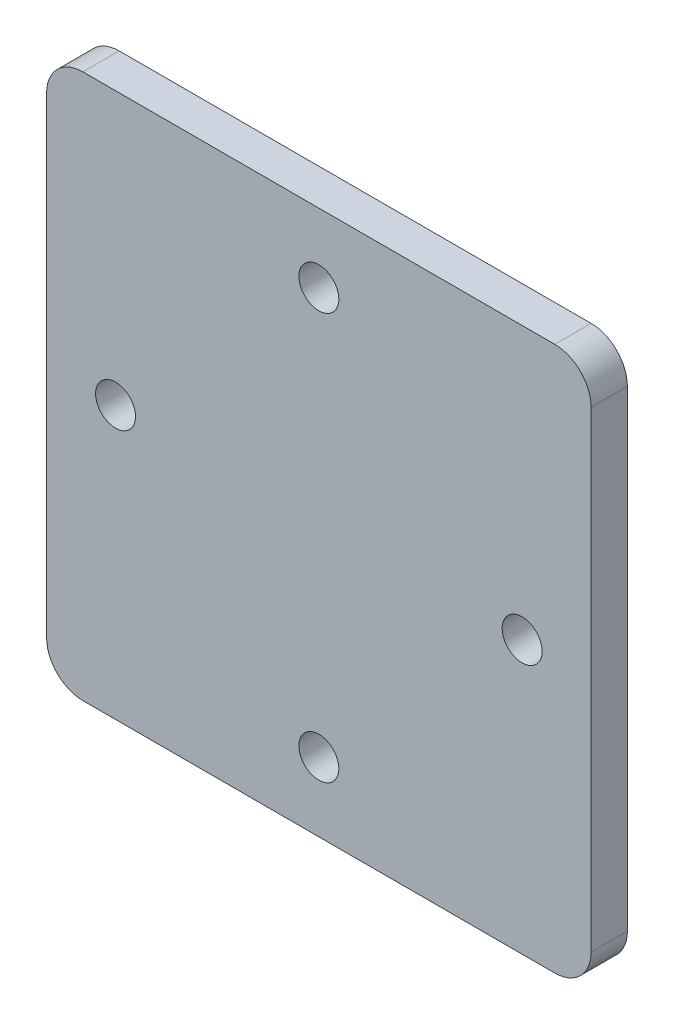
ISO-10303-21;
HEADER;
FILE_DESCRIPTION(('STEP AP214'),'2;1');
FILE_NAME('part.step','',(''),(''),'','','');
FILE_SCHEMA(('AUTOMOTIVE_DESIGN { 1 0 10303 214 1 1 1 1 }'));
ENDSEC;
DATA;
#1=APPLICATION_CONTEXT('core data for automotive mechanical design processes');
#2=APPLICATION_PROTOCOL_DEFINITION('international standard','automotive_design',2000,#1);
#3=PRODUCT_CONTEXT('',#1,'mechanical');
#4=PRODUCT('Part','Part','',(#3));
#5=PRODUCT_RELATED_PRODUCT_CATEGORY('part','',(#4));
#6=PRODUCT_DEFINITION_FORMATION('','',#4);
#7=PRODUCT_DEFINITION_CONTEXT('part definition',#1,'design');
#8=PRODUCT_DEFINITION('design','',#6,#7);
#9=PRODUCT_DEFINITION_SHAPE('','',#8);
#10=(LENGTH_UNIT() NAMED_UNIT(*) SI_UNIT(.MILLI.,.METRE.));
#11=(NAMED_UNIT(*) PLANE_ANGLE_UNIT() SI_UNIT($,.RADIAN.));
#12=(NAMED_UNIT(*) SI_UNIT($,.STERADIAN.) SOLID_ANGLE_UNIT());
#13=UNCERTAINTY_MEASURE_WITH_UNIT(LENGTH_MEASURE(1.E-05),#10,'distance_accuracy_value','');
#14=(GEOMETRIC_REPRESENTATION_CONTEXT(3) GLOBAL_UNCERTAINTY_ASSIGNED_CONTEXT((#13)) GLOBAL_UNIT_ASSIGNED_CONTEXT((#10,
#11,#12)) REPRESENTATION_CONTEXT('',''));
#15=CARTESIAN_POINT('',(0.,0.,0.));
#16=DIRECTION('',(0.,0.,1.));
#17=DIRECTION('',(1.,0.,0.));
#18=AXIS2_PLACEMENT_3D('',#15,#16,#17);
#19=CARTESIAN_POINT('',(-65.,65.,10.));
#20=DIRECTION('',(0.,0.,-1.));
#21=DIRECTION('',(-1.,0.,0.));
#22=AXIS2_PLACEMENT_3D('',#19,#20,#21);
#23=CYLINDRICAL_SURFACE('',#22,10.);
#24=CARTESIAN_POINT('',(-65.,65.,0.));
#25=DIRECTION('',(0.,0.,1.));
#26=DIRECTION('',(1.,0.,0.));
#27=AXIS2_PLACEMENT_3D('',#24,#25,#26);
#28=CIRCLE('',#27,10.);
#29=CARTESIAN_POINT('',(-65.,75.,0.));
#30=VERTEX_POINT('',#29);
#31=CARTESIAN_POINT('',(-75.,65.,0.));
#32=VERTEX_POINT('',#31);
#33=EDGE_CURVE('E131',#30,#32,#28,.T.);
#34=ORIENTED_EDGE('',*,*,#33,.T.);
#35=DIRECTION('',(0.,0.,-1.));
#36=VECTOR('',#35,1.);
#37=CARTESIAN_POINT('',(-75.,65.,10.));
#38=LINE('',#37,#36);
#39=CARTESIAN_POINT('',(-75.,65.,10.));
#40=VERTEX_POINT('',#39);
#41=EDGE_CURVE('E11',#40,#32,#38,.T.);
#42=ORIENTED_EDGE('',*,*,#41,.F.);
#43=CARTESIAN_POINT('',(-65.,65.,10.));
#44=DIRECTION('',(0.,0.,1.));
#45=DIRECTION('',(1.,0.,0.));
#46=AXIS2_PLACEMENT_3D('',#43,#44,#45);
#47=CIRCLE('',#46,10.);
#48=CARTESIAN_POINT('',(-65.,75.,10.));
#49=VERTEX_POINT('',#48);
#50=EDGE_CURVE('E146',#49,#40,#47,.T.);
#51=ORIENTED_EDGE('',*,*,#50,.F.);
#52=DIRECTION('',(0.,0.,-1.));
#53=VECTOR('',#52,1.);
#54=CARTESIAN_POINT('',(-65.,75.,10.));
#55=LINE('',#54,#53);
#56=EDGE_CURVE('E127',#49,#30,#55,.T.);
#57=ORIENTED_EDGE('',*,*,#56,.T.);
#58=EDGE_LOOP('',(#34,#42,#51,#57));
#59=FACE_BOUND('',#58,.T.);
#60=ADVANCED_FACE('F35',(#59),#23,.T.);
#61=CARTESIAN_POINT('',(-75.,-65.,10.));
#62=DIRECTION('',(1.,0.,0.));
#63=DIRECTION('',(0.,1.,0.));
#64=AXIS2_PLACEMENT_3D('',#61,#62,#63);
#65=PLANE('',#64);
#66=DIRECTION('',(0.,-1.,0.));
#67=VECTOR('',#66,1.);
#68=CARTESIAN_POINT('',(-75.,-65.,0.));
#69=LINE('',#68,#67);
#70=CARTESIAN_POINT('',(-75.,-65.,0.));
#71=VERTEX_POINT('',#70);
#72=EDGE_CURVE('E134',#32,#71,#69,.T.);
#73=ORIENTED_EDGE('',*,*,#72,.T.);
#74=DIRECTION('',(0.,0.,-1.));
#75=VECTOR('',#74,1.);
#76=CARTESIAN_POINT('',(-75.,-65.,10.));
#77=LINE('',#76,#75);
#78=CARTESIAN_POINT('',(-75.,-65.,10.));
#79=VERTEX_POINT('',#78);
#80=EDGE_CURVE('E43',#79,#71,#77,.T.);
#81=ORIENTED_EDGE('',*,*,#80,.F.);
#82=DIRECTION('',(0.,-1.,0.));
#83=VECTOR('',#82,1.);
#84=CARTESIAN_POINT('',(-75.,-65.,10.));
#85=LINE('',#84,#83);
#86=EDGE_CURVE('E94',#40,#79,#85,.T.);
#87=ORIENTED_EDGE('',*,*,#86,.F.);
#88=ORIENTED_EDGE('',*,*,#41,.T.);
#89=EDGE_LOOP('',(#73,#81,#87,#88));
#90=FACE_BOUND('',#89,.T.);
#91=ADVANCED_FACE('F228',(#90),#65,.F.);
#92=CARTESIAN_POINT('',(-65.,-65.,10.));
#93=DIRECTION('',(0.,0.,-1.));
#94=DIRECTION('',(-1.,0.,0.));
#95=AXIS2_PLACEMENT_3D('',#92,#93,#94);
#96=CYLINDRICAL_SURFACE('',#95,10.);
#97=CARTESIAN_POINT('',(-65.,-65.,0.));
#98=DIRECTION('',(0.,0.,1.));
#99=DIRECTION('',(-1.,0.,0.));
#100=AXIS2_PLACEMENT_3D('',#97,#98,#99);
#101=CIRCLE('',#100,10.);
#102=CARTESIAN_POINT('',(-65.,-75.,0.));
#103=VERTEX_POINT('',#102);
#104=EDGE_CURVE('E137',#71,#103,#101,.T.);
#105=ORIENTED_EDGE('',*,*,#104,.T.);
#106=DIRECTION('',(0.,0.,-1.));
#107=VECTOR('',#106,1.);
#108=CARTESIAN_POINT('',(-65.,-75.,10.));
#109=LINE('',#108,#107);
#110=CARTESIAN_POINT('',(-65.,-75.,10.));
#111=VERTEX_POINT('',#110);
#112=EDGE_CURVE('E153',#111,#103,#109,.T.);
#113=ORIENTED_EDGE('',*,*,#112,.F.);
#114=CARTESIAN_POINT('',(-65.,-65.,10.));
#115=DIRECTION('',(0.,0.,1.));
#116=DIRECTION('',(-1.,0.,0.));
#117=AXIS2_PLACEMENT_3D('',#114,#115,#116);
#118=CIRCLE('',#117,10.);
#119=EDGE_CURVE('E161',#79,#111,#118,.T.);
#120=ORIENTED_EDGE('',*,*,#119,.F.);
#121=ORIENTED_EDGE('',*,*,#80,.T.);
#122=EDGE_LOOP('',(#105,#113,#120,#121));
#123=FACE_BOUND('',#122,.T.);
#124=ADVANCED_FACE('F159',(#123),#96,.T.);
#125=CARTESIAN_POINT('',(65.,-75.,10.));
#126=DIRECTION('',(0.,1.,0.));
#127=DIRECTION('',(-1.,0.,0.));
#128=AXIS2_PLACEMENT_3D('',#125,#126,#127);
#129=PLANE('',#128);
#130=DIRECTION('',(1.,0.,0.));
#131=VECTOR('',#130,1.);
#132=CARTESIAN_POINT('',(65.,-75.,0.));
#133=LINE('',#132,#131);
#134=CARTESIAN_POINT('',(65.,-75.,0.));
#135=VERTEX_POINT('',#134);
#136=EDGE_CURVE('E139',#103,#135,#133,.T.);
#137=ORIENTED_EDGE('',*,*,#136,.T.);
#138=DIRECTION('',(0.,0.,-1.));
#139=VECTOR('',#138,1.);
#140=CARTESIAN_POINT('',(65.,-75.,10.));
#141=LINE('',#140,#139);
#142=CARTESIAN_POINT('',(65.,-75.,10.));
#143=VERTEX_POINT('',#142);
#144=EDGE_CURVE('E150',#143,#135,#141,.T.);
#145=ORIENTED_EDGE('',*,*,#144,.F.);
#146=DIRECTION('',(1.,0.,0.));
#147=VECTOR('',#146,1.);
#148=CARTESIAN_POINT('',(65.,-75.,10.));
#149=LINE('',#148,#147);
#150=EDGE_CURVE('E173',#111,#143,#149,.T.);
#151=ORIENTED_EDGE('',*,*,#150,.F.);
#152=ORIENTED_EDGE('',*,*,#112,.T.);
#153=EDGE_LOOP('',(#137,#145,#151,#152));
#154=FACE_BOUND('',#153,.T.);
#155=ADVANCED_FACE('F169',(#154),#129,.F.);
#156=CARTESIAN_POINT('',(65.,-65.,10.));
#157=DIRECTION('',(0.,0.,-1.));
#158=DIRECTION('',(-1.,0.,0.));
#159=AXIS2_PLACEMENT_3D('',#156,#157,#158);
#160=CYLINDRICAL_SURFACE('',#159,9.99999999999999);
#161=CARTESIAN_POINT('',(65.,-65.,0.));
#162=DIRECTION('',(0.,0.,1.));
#163=DIRECTION('',(-1.,0.,0.));
#164=AXIS2_PLACEMENT_3D('',#161,#162,#163);
#165=CIRCLE('',#164,9.99999999999999);
#166=CARTESIAN_POINT('',(75.,-65.,0.));
#167=VERTEX_POINT('',#166);
#168=EDGE_CURVE('E141',#135,#167,#165,.T.);
#169=ORIENTED_EDGE('',*,*,#168,.T.);
#170=DIRECTION('',(0.,0.,-1.));
#171=VECTOR('',#170,1.);
#172=CARTESIAN_POINT('',(75.,-65.,10.));
#173=LINE('',#172,#171);
#174=CARTESIAN_POINT('',(75.,-65.,10.));
#175=VERTEX_POINT('',#174);
#176=EDGE_CURVE('E122',#175,#167,#173,.T.);
#177=ORIENTED_EDGE('',*,*,#176,.F.);
#178=CARTESIAN_POINT('',(65.,-65.,10.));
#179=DIRECTION('',(0.,0.,1.));
#180=DIRECTION('',(-1.,0.,0.));
#181=AXIS2_PLACEMENT_3D('',#178,#179,#180);
#182=CIRCLE('',#181,9.99999999999999);
#183=EDGE_CURVE('E113',#143,#175,#182,.T.);
#184=ORIENTED_EDGE('',*,*,#183,.F.);
#185=ORIENTED_EDGE('',*,*,#144,.T.);
#186=EDGE_LOOP('',(#169,#177,#184,#185));
#187=FACE_BOUND('',#186,.T.);
#188=ADVANCED_FACE('F172',(#187),#160,.T.);
#189=CARTESIAN_POINT('',(75.,-65.,10.));
#190=DIRECTION('',(-1.,0.,0.));
#191=DIRECTION('',(0.,-1.,0.));
#192=AXIS2_PLACEMENT_3D('',#189,#190,#191);
#193=PLANE('',#192);
#194=DIRECTION('',(0.,1.,0.));
#195=VECTOR('',#194,1.);
#196=CARTESIAN_POINT('',(75.,-65.,0.));
#197=LINE('',#196,#195);
#198=CARTESIAN_POINT('',(75.,65.,0.));
#199=VERTEX_POINT('',#198);
#200=EDGE_CURVE('E121',#167,#199,#197,.T.);
#201=ORIENTED_EDGE('',*,*,#200,.T.);
#202=DIRECTION('',(0.,0.,-1.));
#203=VECTOR('',#202,1.);
#204=CARTESIAN_POINT('',(75.,65.,10.));
#205=LINE('',#204,#203);
#206=CARTESIAN_POINT('',(75.,65.,10.));
#207=VERTEX_POINT('',#206);
#208=EDGE_CURVE('E118',#207,#199,#205,.T.);
#209=ORIENTED_EDGE('',*,*,#208,.F.);
#210=DIRECTION('',(0.,1.,0.));
#211=VECTOR('',#210,1.);
#212=CARTESIAN_POINT('',(75.,-65.,10.));
#213=LINE('',#212,#211);
#214=EDGE_CURVE('E107',#175,#207,#213,.T.);
#215=ORIENTED_EDGE('',*,*,#214,.F.);
#216=ORIENTED_EDGE('',*,*,#176,.T.);
#217=EDGE_LOOP('',(#201,#209,#215,#216));
#218=FACE_BOUND('',#217,.T.);
#219=ADVANCED_FACE('F119',(#218),#193,.F.);
#220=CARTESIAN_POINT('',(65.,65.,10.));
#221=DIRECTION('',(0.,0.,-1.));
#222=DIRECTION('',(-1.,0.,0.));
#223=AXIS2_PLACEMENT_3D('',#220,#221,#222);
#224=CYLINDRICAL_SURFACE('',#223,9.99999999999997);
#225=CARTESIAN_POINT('',(65.,65.,0.));
#226=DIRECTION('',(0.,0.,1.));
#227=DIRECTION('',(1.,0.,0.));
#228=AXIS2_PLACEMENT_3D('',#225,#226,#227);
#229=CIRCLE('',#228,9.99999999999997);
#230=CARTESIAN_POINT('',(65.,75.,0.));
#231=VERTEX_POINT('',#230);
#232=EDGE_CURVE('E80',#199,#231,#229,.T.);
#233=ORIENTED_EDGE('',*,*,#232,.T.);
#234=DIRECTION('',(0.,0.,-1.));
#235=VECTOR('',#234,1.);
#236=CARTESIAN_POINT('',(65.,75.,10.));
#237=LINE('',#236,#235);
#238=CARTESIAN_POINT('',(65.,75.,10.));
#239=VERTEX_POINT('',#238);
#240=EDGE_CURVE('E123',#239,#231,#237,.T.);
#241=ORIENTED_EDGE('',*,*,#240,.F.);
#242=CARTESIAN_POINT('',(65.,65.,10.));
#243=DIRECTION('',(0.,0.,1.));
#244=DIRECTION('',(1.,0.,0.));
#245=AXIS2_PLACEMENT_3D('',#242,#243,#244);
#246=CIRCLE('',#245,9.99999999999997);
#247=EDGE_CURVE('E111',#207,#239,#246,.T.);
#248=ORIENTED_EDGE('',*,*,#247,.F.);
#249=ORIENTED_EDGE('',*,*,#208,.T.);
#250=EDGE_LOOP('',(#233,#241,#248,#249));
#251=FACE_BOUND('',#250,.T.);
#252=ADVANCED_FACE('F125',(#251),#224,.T.);
#253=CARTESIAN_POINT('',(65.,75.,10.));
#254=DIRECTION('',(0.,-1.,0.));
#255=DIRECTION('',(0.,0.,-1.));
#256=AXIS2_PLACEMENT_3D('',#253,#254,#255);
#257=PLANE('',#256);
#258=DIRECTION('',(-1.,0.,0.));
#259=VECTOR('',#258,1.);
#260=CARTESIAN_POINT('',(65.,75.,0.));
#261=LINE('',#260,#259);
#262=EDGE_CURVE('E86',#231,#30,#261,.T.);
#263=ORIENTED_EDGE('',*,*,#262,.T.);
#264=ORIENTED_EDGE('',*,*,#56,.F.);
#265=DIRECTION('',(-1.,0.,0.));
#266=VECTOR('',#265,1.);
#267=CARTESIAN_POINT('',(65.,75.,10.));
#268=LINE('',#267,#266);
#269=EDGE_CURVE('E51',#239,#49,#268,.T.);
#270=ORIENTED_EDGE('',*,*,#269,.F.);
#271=ORIENTED_EDGE('',*,*,#240,.T.);
#272=EDGE_LOOP('',(#263,#264,#270,#271));
#273=FACE_BOUND('',#272,.T.);
#274=ADVANCED_FACE('F235',(#273),#257,.F.);
#275=CARTESIAN_POINT('',(-65.,65.,10.));
#276=DIRECTION('',(0.,0.,1.));
#277=DIRECTION('',(1.,0.,0.));
#278=AXIS2_PLACEMENT_3D('',#275,#276,#277);
#279=PLANE('',#278);
#280=CARTESIAN_POINT('',(0.000295224406801284,55.9999999992218,10.));
#281=DIRECTION('',(0.,0.,-1.));
#282=DIRECTION('',(-1.,0.,0.));
#283=AXIS2_PLACEMENT_3D('',#280,#281,#282);
#284=CIRCLE('',#283,5.49999999999999);
#285=CARTESIAN_POINT('',(-5.49970477559319,55.9999999992218,10.));
#286=VERTEX_POINT('',#285);
#287=EDGE_CURVE('E196',#286,#286,#284,.T.);
#288=ORIENTED_EDGE('',*,*,#287,.T.);
#289=EDGE_LOOP('',(#288));
#290=FACE_BOUND('',#289,.T.);
#291=CARTESIAN_POINT('',(-0.000295224406813427,-55.9999999992218,10.));
#292=DIRECTION('',(0.,0.,-1.));
#293=DIRECTION('',(-1.,0.,0.));
#294=AXIS2_PLACEMENT_3D('',#291,#292,#293);
#295=CIRCLE('',#294,5.49999999999999);
#296=CARTESIAN_POINT('',(-5.5002952244068,-55.9999999992218,10.));
#297=VERTEX_POINT('',#296);
#298=EDGE_CURVE('E190',#297,#297,#295,.T.);
#299=ORIENTED_EDGE('',*,*,#298,.T.);
#300=EDGE_LOOP('',(#299));
#301=FACE_BOUND('',#300,.T.);
#302=CARTESIAN_POINT('',(55.9999999992218,-0.000295224406816896,10.));
#303=DIRECTION('',(0.,0.,-1.));
#304=DIRECTION('',(-1.,0.,0.));
#305=AXIS2_PLACEMENT_3D('',#302,#303,#304);
#306=CIRCLE('',#305,5.49999999999998);
#307=CARTESIAN_POINT('',(50.4999999992218,-0.000295224406816896,10.));
#308=VERTEX_POINT('',#307);
#309=EDGE_CURVE('E184',#308,#308,#306,.T.);
#310=ORIENTED_EDGE('',*,*,#309,.T.);
#311=EDGE_LOOP('',(#310));
#312=FACE_BOUND('',#311,.T.);
#313=CARTESIAN_POINT('',(-55.9999999992218,0.000295224406799549,10.));
#314=DIRECTION('',(0.,0.,-1.));
#315=DIRECTION('',(-1.,0.,0.));
#316=AXIS2_PLACEMENT_3D('',#313,#314,#315);
#317=CIRCLE('',#316,5.49999999999998);
#318=CARTESIAN_POINT('',(-61.4999999992218,0.000295224406799549,10.));
#319=VERTEX_POINT('',#318);
#320=EDGE_CURVE('E135',#319,#319,#317,.T.);
#321=ORIENTED_EDGE('',*,*,#320,.T.);
#322=EDGE_LOOP('',(#321));
#323=FACE_BOUND('',#322,.T.);
#324=ORIENTED_EDGE('',*,*,#50,.T.);
#325=ORIENTED_EDGE('',*,*,#86,.T.);
#326=ORIENTED_EDGE('',*,*,#119,.T.);
#327=ORIENTED_EDGE('',*,*,#150,.T.);
#328=ORIENTED_EDGE('',*,*,#183,.T.);
#329=ORIENTED_EDGE('',*,*,#214,.T.);
#330=ORIENTED_EDGE('',*,*,#247,.T.);
#331=ORIENTED_EDGE('',*,*,#269,.T.);
#332=EDGE_LOOP('',(#324,#325,#326,#327,#328,#329,#330,#331));
#333=FACE_BOUND('',#332,.T.);
#334=ADVANCED_FACE('F109',(#290,#301,#312,#323,#333),#279,.T.);
#335=CARTESIAN_POINT('',(-65.,65.,0.));
#336=DIRECTION('',(0.,0.,1.));
#337=DIRECTION('',(1.,0.,0.));
#338=AXIS2_PLACEMENT_3D('',#335,#336,#337);
#339=PLANE('',#338);
#340=CARTESIAN_POINT('',(0.000295224406801284,55.9999999992218,0.));
#341=DIRECTION('',(0.,0.,-1.));
#342=DIRECTION('',(-1.,0.,0.));
#343=AXIS2_PLACEMENT_3D('',#340,#341,#342);
#344=CIRCLE('',#343,5.49999999999999);
#345=CARTESIAN_POINT('',(-5.49970477559319,55.9999999992218,0.));
#346=VERTEX_POINT('',#345);
#347=EDGE_CURVE('E199',#346,#346,#344,.T.);
#348=ORIENTED_EDGE('',*,*,#347,.F.);
#349=EDGE_LOOP('',(#348));
#350=FACE_BOUND('',#349,.T.);
#351=CARTESIAN_POINT('',(-0.000295224406813427,-55.9999999992218,0.));
#352=DIRECTION('',(0.,0.,-1.));
#353=DIRECTION('',(-1.,0.,0.));
#354=AXIS2_PLACEMENT_3D('',#351,#352,#353);
#355=CIRCLE('',#354,5.49999999999999);
#356=CARTESIAN_POINT('',(-5.5002952244068,-55.9999999992218,0.));
#357=VERTEX_POINT('',#356);
#358=EDGE_CURVE('E193',#357,#357,#355,.T.);
#359=ORIENTED_EDGE('',*,*,#358,.F.);
#360=EDGE_LOOP('',(#359));
#361=FACE_BOUND('',#360,.T.);
#362=CARTESIAN_POINT('',(55.9999999992218,-0.000295224406816896,0.));
#363=DIRECTION('',(0.,0.,-1.));
#364=DIRECTION('',(-1.,0.,0.));
#365=AXIS2_PLACEMENT_3D('',#362,#363,#364);
#366=CIRCLE('',#365,5.49999999999998);
#367=CARTESIAN_POINT('',(50.4999999992218,-0.000295224406816896,0.));
#368=VERTEX_POINT('',#367);
#369=EDGE_CURVE('E187',#368,#368,#366,.T.);
#370=ORIENTED_EDGE('',*,*,#369,.F.);
#371=EDGE_LOOP('',(#370));
#372=FACE_BOUND('',#371,.T.);
#373=CARTESIAN_POINT('',(-55.9999999992218,0.000295224406799549,0.));
#374=DIRECTION('',(0.,0.,-1.));
#375=DIRECTION('',(-1.,0.,0.));
#376=AXIS2_PLACEMENT_3D('',#373,#374,#375);
#377=CIRCLE('',#376,5.49999999999998);
#378=CARTESIAN_POINT('',(-61.4999999992218,0.000295224406799549,0.));
#379=VERTEX_POINT('',#378);
#380=EDGE_CURVE('E181',#379,#379,#377,.T.);
#381=ORIENTED_EDGE('',*,*,#380,.F.);
#382=EDGE_LOOP('',(#381));
#383=FACE_BOUND('',#382,.T.);
#384=ORIENTED_EDGE('',*,*,#33,.F.);
#385=ORIENTED_EDGE('',*,*,#262,.F.);
#386=ORIENTED_EDGE('',*,*,#232,.F.);
#387=ORIENTED_EDGE('',*,*,#200,.F.);
#388=ORIENTED_EDGE('',*,*,#168,.F.);
#389=ORIENTED_EDGE('',*,*,#136,.F.);
#390=ORIENTED_EDGE('',*,*,#104,.F.);
#391=ORIENTED_EDGE('',*,*,#72,.F.);
#392=EDGE_LOOP('',(#384,#385,#386,#387,#388,#389,#390,#391));
#393=FACE_BOUND('',#392,.T.);
#394=ADVANCED_FACE('F165',(#350,#361,#372,#383,#393),#339,.F.);
#395=CARTESIAN_POINT('',(-55.9999999992218,0.000295224406799549,0.));
#396=DIRECTION('',(0.,0.,-1.));
#397=DIRECTION('',(-1.,0.,0.));
#398=AXIS2_PLACEMENT_3D('',#395,#396,#397);
#399=CYLINDRICAL_SURFACE('',#398,5.49999999999998);
#400=ORIENTED_EDGE('',*,*,#320,.F.);
#401=EDGE_LOOP('',(#400));
#402=FACE_BOUND('',#401,.T.);
#403=ORIENTED_EDGE('',*,*,#380,.T.);
#404=EDGE_LOOP('',(#403));
#405=FACE_BOUND('',#404,.T.);
#406=ADVANCED_FACE('F207',(#402,#405),#399,.F.);
#407=CARTESIAN_POINT('',(55.9999999992218,-0.000295224406816896,0.));
#408=DIRECTION('',(0.,0.,-1.));
#409=DIRECTION('',(-1.,0.,0.));
#410=AXIS2_PLACEMENT_3D('',#407,#408,#409);
#411=CYLINDRICAL_SURFACE('',#410,5.49999999999998);
#412=ORIENTED_EDGE('',*,*,#309,.F.);
#413=EDGE_LOOP('',(#412));
#414=FACE_BOUND('',#413,.T.);
#415=ORIENTED_EDGE('',*,*,#369,.T.);
#416=EDGE_LOOP('',(#415));
#417=FACE_BOUND('',#416,.T.);
#418=ADVANCED_FACE('F216',(#414,#417),#411,.F.);
#419=CARTESIAN_POINT('',(-0.000295224406813427,-55.9999999992218,0.));
#420=DIRECTION('',(0.,0.,-1.));
#421=DIRECTION('',(-1.,0.,0.));
#422=AXIS2_PLACEMENT_3D('',#419,#420,#421);
#423=CYLINDRICAL_SURFACE('',#422,5.49999999999999);
#424=ORIENTED_EDGE('',*,*,#298,.F.);
#425=EDGE_LOOP('',(#424));
#426=FACE_BOUND('',#425,.T.);
#427=ORIENTED_EDGE('',*,*,#358,.T.);
#428=EDGE_LOOP('',(#427));
#429=FACE_BOUND('',#428,.T.);
#430=ADVANCED_FACE('F222',(#426,#429),#423,.F.);
#431=CARTESIAN_POINT('',(0.000295224406801284,55.9999999992218,0.));
#432=DIRECTION('',(0.,0.,-1.));
#433=DIRECTION('',(-1.,0.,0.));
#434=AXIS2_PLACEMENT_3D('',#431,#432,#433);
#435=CYLINDRICAL_SURFACE('',#434,5.49999999999999);
#436=ORIENTED_EDGE('',*,*,#287,.F.);
#437=EDGE_LOOP('',(#436));
#438=FACE_BOUND('',#437,.T.);
#439=ORIENTED_EDGE('',*,*,#347,.T.);
#440=EDGE_LOOP('',(#439));
#441=FACE_BOUND('',#440,.T.);
#442=ADVANCED_FACE('F203',(#438,#441),#435,.F.);
#443=CLOSED_SHELL('',(#60,#91,#124,#155,#188,#219,#252,#274,#334,#394,#406,#418,#430,#442));
#444=MANIFOLD_SOLID_BREP('B2',#443);
#445=ADVANCED_BREP_SHAPE_REPRESENTATION('',(#18,#444),#14);
#446=SHAPE_DEFINITION_REPRESENTATION(#9,#445);
ENDSEC;
END-ISO-10303-21;
